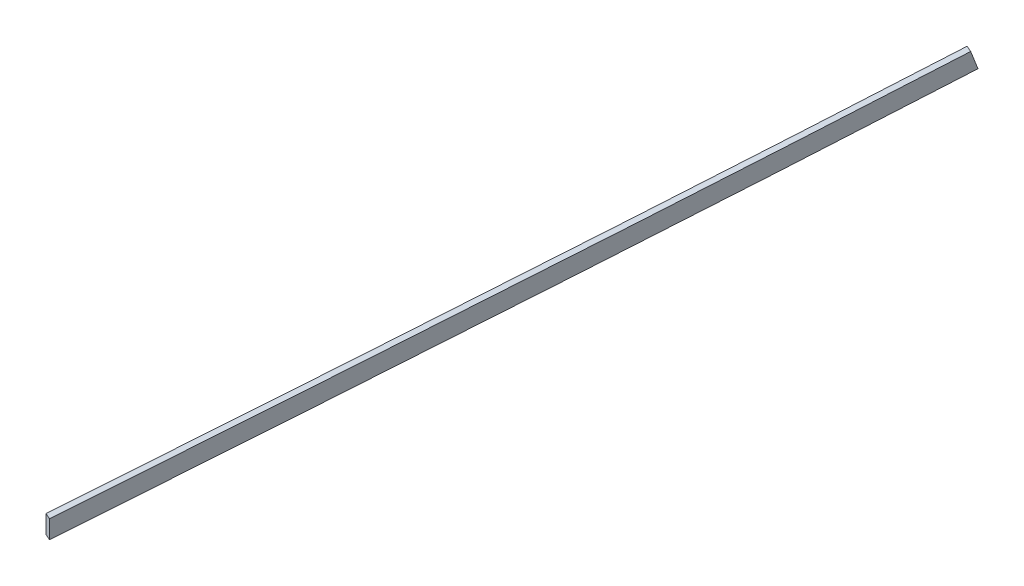
ISO-10303-21;
HEADER;
FILE_DESCRIPTION(('STEP AP214'),'2;1');
FILE_NAME('part.step','',(''),(''),'','','');
FILE_SCHEMA(('AUTOMOTIVE_DESIGN { 1 0 10303 214 1 1 1 1 }'));
ENDSEC;
DATA;
#1=APPLICATION_CONTEXT('core data for automotive mechanical design processes');
#2=APPLICATION_PROTOCOL_DEFINITION('international standard','automotive_design',2000,#1);
#3=PRODUCT_CONTEXT('',#1,'mechanical');
#4=PRODUCT('Part','Part','',(#3));
#5=PRODUCT_RELATED_PRODUCT_CATEGORY('part','',(#4));
#6=PRODUCT_DEFINITION_FORMATION('','',#4);
#7=PRODUCT_DEFINITION_CONTEXT('part definition',#1,'design');
#8=PRODUCT_DEFINITION('design','',#6,#7);
#9=PRODUCT_DEFINITION_SHAPE('','',#8);
#10=(LENGTH_UNIT() NAMED_UNIT(*) SI_UNIT(.MILLI.,.METRE.));
#11=(NAMED_UNIT(*) PLANE_ANGLE_UNIT() SI_UNIT($,.RADIAN.));
#12=(NAMED_UNIT(*) SI_UNIT($,.STERADIAN.) SOLID_ANGLE_UNIT());
#13=UNCERTAINTY_MEASURE_WITH_UNIT(LENGTH_MEASURE(1.E-05),#10,'distance_accuracy_value','');
#14=(GEOMETRIC_REPRESENTATION_CONTEXT(3) GLOBAL_UNCERTAINTY_ASSIGNED_CONTEXT((#13)) GLOBAL_UNIT_ASSIGNED_CONTEXT((#10,
#11,#12)) REPRESENTATION_CONTEXT('',''));
#15=CARTESIAN_POINT('',(0.,0.,0.));
#16=DIRECTION('',(0.,0.,1.));
#17=DIRECTION('',(1.,0.,0.));
#18=AXIS2_PLACEMENT_3D('',#15,#16,#17);
#19=CARTESIAN_POINT('',(372.076532412698,-3.43417317103476,-328.0270755074));
#20=CARTESIAN_POINT('',(363.13696077513,-10.9008739759838,-307.997374904358));
#21=CARTESIAN_POINT('',(354.184340446264,-18.2717834383074,-287.938437846756));
#22=CARTESIAN_POINT('',(336.260804803844,-32.8792976188066,-247.779572610204));
#23=CARTESIAN_POINT('',(327.289792807259,-40.115568888525,-227.679427806534));
#24=CARTESIAN_POINT('',(300.357200411634,-61.6758445948004,-167.335175976714));
#25=CARTESIAN_POINT('',(282.376262856929,-75.8544545801199,-127.047697964992));
#26=CARTESIAN_POINT('',(264.380532412715,-89.9188438629446,-86.7270755074388));
#27=B_SPLINE_CURVE_WITH_KNOTS('',3,(#19,#20,#21,#22,#23,#24,#25,#26),.UNSPECIFIED.,.F.,.F.,(4,2,
2,4),(0.,0.25,0.5,1.),.UNSPECIFIED.);
#28=DIRECTION('',(0.913176215468958,0.,0.407564963535621));
#29=VECTOR('',#28,1.);
#30=SURFACE_OF_LINEAR_EXTRUSION('',#27,#29);
#31=CARTESIAN_POINT('',(374.39599999999,-3.43417317103476,-326.991860500019));
#32=CARTESIAN_POINT('',(365.456428362421,-10.9008739759838,-306.962159896978));
#33=CARTESIAN_POINT('',(356.503808033555,-18.2717834383074,-286.903222839375));
#34=CARTESIAN_POINT('',(338.580272391136,-32.8792976188066,-246.744357602823));
#35=CARTESIAN_POINT('',(329.60926039455,-40.115568888525,-226.644212799154));
#36=CARTESIAN_POINT('',(303.448104453656,-61.0582886458762,-168.028415290075));
#37=CARTESIAN_POINT('',(286.240779100297,-74.6357311994796,-129.474266503067));
#38=CARTESIAN_POINT('',(269.019468555382,-88.1053819619746,-90.8887829708289));
#39=B_SPLINE_CURVE_WITH_KNOTS('',3,(#31,#32,#33,#34,#35,#36,#37,#38),.UNSPECIFIED.,.F.,.F.,(4,2,
2,4),(0.,0.25,0.5,0.978517577047574),.UNSPECIFIED.);
#40=CARTESIAN_POINT('',(374.39599999999,-3.43417317103476,-326.991860500019));
#41=VERTEX_POINT('',#40);
#42=CARTESIAN_POINT('',(269.019468072583,-88.1053782459471,-90.8887818890859));
#43=VERTEX_POINT('',#42);
#44=EDGE_CURVE('E85',#41,#43,#39,.T.);
#45=ORIENTED_EDGE('',*,*,#44,.T.);
#46=DIRECTION('',(-0.913176215468928,-2.15085909467366E-13,-0.407564963535686));
#47=VECTOR('',#46,1.);
#48=CARTESIAN_POINT('',(359.48535339613,-88.1053827171896,-50.5124275632588));
#49=LINE('',#48,#47);
#50=CARTESIAN_POINT('',(266.700000002554,-88.1053827172114,-91.9239958147157));
#51=VERTEX_POINT('',#50);
#52=EDGE_CURVE('E49',#43,#51,#49,.T.);
#53=ORIENTED_EDGE('',*,*,#52,.T.);
#54=CARTESIAN_POINT('',(266.70000096553,-88.1053819639777,-91.923997972471));
#55=CARTESIAN_POINT('',(283.9213115113,-74.6357312008258,-130.509481506625));
#56=CARTESIAN_POINT('',(301.128636865513,-61.0582886465581,-169.063630295547));
#57=CARTESIAN_POINT('',(327.289792807259,-40.115568888525,-227.679427806534));
#58=CARTESIAN_POINT('',(336.260804803844,-32.8792976188066,-247.779572610204));
#59=CARTESIAN_POINT('',(354.184340446264,-18.2717834383074,-287.938437846756));
#60=CARTESIAN_POINT('',(363.13696077513,-10.9008739759838,-307.997374904358));
#61=CARTESIAN_POINT('',(372.076532412698,-3.43417317103476,-328.0270755074));
#62=B_SPLINE_CURVE_WITH_KNOTS('',3,(#54,#55,#56,#57,#58,#59,#60,#61),.UNSPECIFIED.,.F.,.F.,(4,2,
2,4),(0.,0.478517577071295,0.728517577071295,0.978517577071296),.UNSPECIFIED.);
#63=CARTESIAN_POINT('',(372.076532412698,-3.43417317103476,-328.0270755074));
#64=VERTEX_POINT('',#63);
#65=EDGE_CURVE('E80',#64,#51,#62,.F.);
#66=ORIENTED_EDGE('',*,*,#65,.F.);
#67=DIRECTION('',(0.913176215468958,0.,0.407564963535621));
#68=VECTOR('',#67,1.);
#69=CARTESIAN_POINT('',(372.076532412698,-3.43417317103476,-328.0270755074));
#70=LINE('',#69,#68);
#71=EDGE_CURVE('E74',#64,#41,#70,.T.);
#72=ORIENTED_EDGE('',*,*,#71,.T.);
#73=EDGE_LOOP('',(#45,#53,#66,#72));
#74=FACE_BOUND('',#73,.T.);
#75=ADVANCED_FACE('F33',(#74),#30,.F.);
#76=CARTESIAN_POINT('',(263.595053790064,-83.868371447221,-84.9671587821577));
#77=CARTESIAN_POINT('',(272.590410009401,-76.8381376926848,-105.121848424541));
#78=CARTESIAN_POINT('',(290.574277776222,-62.7200095072328,-145.415891770012));
#79=CARTESIAN_POINT('',(317.51638939553,-41.3143631990579,-205.781472049121));
#80=CARTESIAN_POINT('',(344.417266238379,-19.6156169259641,-266.054663088524));
#81=CARTESIAN_POINT('',(362.309134238171,-4.88446501496835,-306.14257488051));
#82=CARTESIAN_POINT('',(371.242524401777,2.57707276668637,-326.15842548293));
#83=B_SPLINE_CURVE_WITH_KNOTS('',3,(#76,#77,#78,#79,#80,#81,#82),.UNSPECIFIED.,.F.,.F.,(4,1,1,1,
4),(0.,0.25,0.5,0.75,1.),.UNSPECIFIED.);
#84=DIRECTION('',(0.913176215468958,0.,0.407564963535621));
#85=VECTOR('',#84,1.);
#86=SURFACE_OF_LINEAR_EXTRUSION('',#83,#85);
#87=CARTESIAN_POINT('',(266.700000001149,-81.4404627145999,-91.9239958115715));
#88=VERTEX_POINT('',#87);
#89=CARTESIAN_POINT('',(371.242524401777,2.57707276668637,-326.15842548293));
#90=VERTEX_POINT('',#89);
#91=EDGE_CURVE('E117',#88,#90,#83,.T.);
#92=ORIENTED_EDGE('',*,*,#91,.F.);
#93=DIRECTION('',(-0.913176215468928,-2.15085909467366E-13,-0.407564963535686));
#94=VECTOR('',#93,1.);
#95=CARTESIAN_POINT('',(359.485353394726,-81.440462714578,-50.5124275601146));
#96=LINE('',#95,#94);
#97=CARTESIAN_POINT('',(269.019467588389,-81.4404627145993,-90.8887808042138));
#98=VERTEX_POINT('',#97);
#99=EDGE_CURVE('E166',#98,#88,#96,.T.);
#100=ORIENTED_EDGE('',*,*,#99,.F.);
#101=CARTESIAN_POINT('',(265.914521377355,-83.868371447221,-83.9319437747772));
#102=CARTESIAN_POINT('',(274.909877596692,-76.8381376926848,-104.086633417161));
#103=CARTESIAN_POINT('',(292.893745363513,-62.7200095072328,-144.380676762632));
#104=CARTESIAN_POINT('',(319.835856982821,-41.3143631990579,-204.746257041741));
#105=CARTESIAN_POINT('',(346.73673382567,-19.6156169259641,-265.019448081144));
#106=CARTESIAN_POINT('',(364.628601825462,-4.88446501496835,-305.10735987313));
#107=CARTESIAN_POINT('',(373.561991989068,2.57707276668637,-325.12321047555));
#108=B_SPLINE_CURVE_WITH_KNOTS('',3,(#101,#102,#103,#104,#105,#106,#107),.UNSPECIFIED.,.F.,.F.,
(4,1,1,1,4),(0.,0.25,0.5,0.75,1.),.UNSPECIFIED.);
#109=CARTESIAN_POINT('',(373.561991989068,2.57707276668637,-325.12321047555));
#110=VERTEX_POINT('',#109);
#111=EDGE_CURVE('E81',#98,#110,#108,.T.);
#112=ORIENTED_EDGE('',*,*,#111,.T.);
#113=DIRECTION('',(0.913176215468958,0.,0.407564963535621));
#114=VECTOR('',#113,1.);
#115=CARTESIAN_POINT('',(371.242524401777,2.57707276668637,-326.15842548293));
#116=LINE('',#115,#114);
#117=EDGE_CURVE('E43',#90,#110,#116,.T.);
#118=ORIENTED_EDGE('',*,*,#117,.F.);
#119=EDGE_LOOP('',(#92,#100,#112,#118));
#120=FACE_BOUND('',#119,.T.);
#121=ADVANCED_FACE('F113',(#120),#86,.F.);
#122=CARTESIAN_POINT('',(372.076532412698,-3.43417317103476,-328.0270755074));
#123=DIRECTION('',(-0.38582255612771,-0.322254992431608,0.864460915852177));
#124=DIRECTION('',(0.913176215468958,0.,0.407564963535621));
#125=AXIS2_PLACEMENT_3D('',#122,#123,#124);
#126=PLANE('',#125);
#127=DIRECTION('',(0.13133984423956,-0.94665290357813,-0.294275594404673));
#128=VECTOR('',#127,1.);
#129=CARTESIAN_POINT('',(374.39599999999,-3.43417317103476,-326.991860500019));
#130=LINE('',#129,#128);
#131=EDGE_CURVE('E71',#110,#41,#130,.T.);
#132=ORIENTED_EDGE('',*,*,#131,.T.);
#133=ORIENTED_EDGE('',*,*,#71,.F.);
#134=DIRECTION('',(0.13133984423956,-0.94665290357813,-0.294275594404673));
#135=VECTOR('',#134,1.);
#136=CARTESIAN_POINT('',(372.076532412698,-3.43417317103476,-328.0270755074));
#137=LINE('',#136,#135);
#138=EDGE_CURVE('E58',#90,#64,#137,.T.);
#139=ORIENTED_EDGE('',*,*,#138,.F.);
#140=ORIENTED_EDGE('',*,*,#117,.T.);
#141=EDGE_LOOP('',(#132,#133,#139,#140));
#142=FACE_BOUND('',#141,.T.);
#143=ADVANCED_FACE('F73',(#142),#126,.F.);
#144=CARTESIAN_POINT('',(318.312262008718,-47.3023274572834,-207.564677196594));
#145=DIRECTION('',(0.913176215468981,-1.71757281135695E-13,0.407564963535569));
#146=DIRECTION('',(0.407564963535569,0.,-0.913176215468981));
#147=AXIS2_PLACEMENT_3D('',#144,#145,#146);
#148=PLANE('',#147);
#149=ORIENTED_EDGE('',*,*,#65,.T.);
#150=DIRECTION('',(2.10836631455067E-10,-1.,-4.71858777756957E-10));
#151=VECTOR('',#150,1.);
#152=CARTESIAN_POINT('',(266.700000001149,-81.4404627146001,-91.9239958115708));
#153=LINE('',#152,#151);
#154=EDGE_CURVE('E160',#88,#51,#153,.T.);
#155=ORIENTED_EDGE('',*,*,#154,.F.);
#156=ORIENTED_EDGE('',*,*,#91,.T.);
#157=ORIENTED_EDGE('',*,*,#138,.T.);
#158=EDGE_LOOP('',(#149,#155,#156,#157));
#159=FACE_BOUND('',#158,.T.);
#160=ADVANCED_FACE('F109',(#159),#148,.F.);
#161=CARTESIAN_POINT('',(320.631729596009,-47.3023274572834,-206.529462189214));
#162=DIRECTION('',(0.913176215468981,-1.71757281135695E-13,0.407564963535569));
#163=DIRECTION('',(0.407564963535569,0.,-0.913176215468981));
#164=AXIS2_PLACEMENT_3D('',#161,#162,#163);
#165=PLANE('',#164);
#166=DIRECTION('',(-2.10480813324328E-10,1.,4.72017585006886E-10));
#167=VECTOR('',#166,1.);
#168=CARTESIAN_POINT('',(269.019467581203,-47.3023275227312,-90.8887807880993));
#169=LINE('',#168,#167);
#170=EDGE_CURVE('E11',#43,#98,#169,.T.);
#171=ORIENTED_EDGE('',*,*,#170,.F.);
#172=ORIENTED_EDGE('',*,*,#44,.F.);
#173=ORIENTED_EDGE('',*,*,#131,.F.);
#174=ORIENTED_EDGE('',*,*,#111,.F.);
#175=EDGE_LOOP('',(#171,#172,#173,#174));
#176=FACE_BOUND('',#175,.T.);
#177=ADVANCED_FACE('F90',(#176),#165,.T.);
#178=CARTESIAN_POINT('',(359.485353394725,-81.4404627145782,-50.5124275601139));
#179=DIRECTION('',(0.407564963535686,5.16819836918863E-10,-0.913176215468928));
#180=DIRECTION('',(-0.913176215468928,0.,-0.407564963535686));
#181=AXIS2_PLACEMENT_3D('',#178,#179,#180);
#182=PLANE('',#181);
#183=ORIENTED_EDGE('',*,*,#170,.T.);
#184=ORIENTED_EDGE('',*,*,#99,.T.);
#185=ORIENTED_EDGE('',*,*,#154,.T.);
#186=ORIENTED_EDGE('',*,*,#52,.F.);
#187=EDGE_LOOP('',(#183,#184,#185,#186));
#188=FACE_BOUND('',#187,.T.);
#189=ADVANCED_FACE('F108',(#188),#182,.F.);
#190=CLOSED_SHELL('',(#75,#121,#143,#160,#177,#189));
#191=MANIFOLD_SOLID_BREP('B2',#190);
#192=ADVANCED_BREP_SHAPE_REPRESENTATION('',(#18,#191),#14);
#193=SHAPE_DEFINITION_REPRESENTATION(#9,#192);
ENDSEC;
END-ISO-10303-21;
